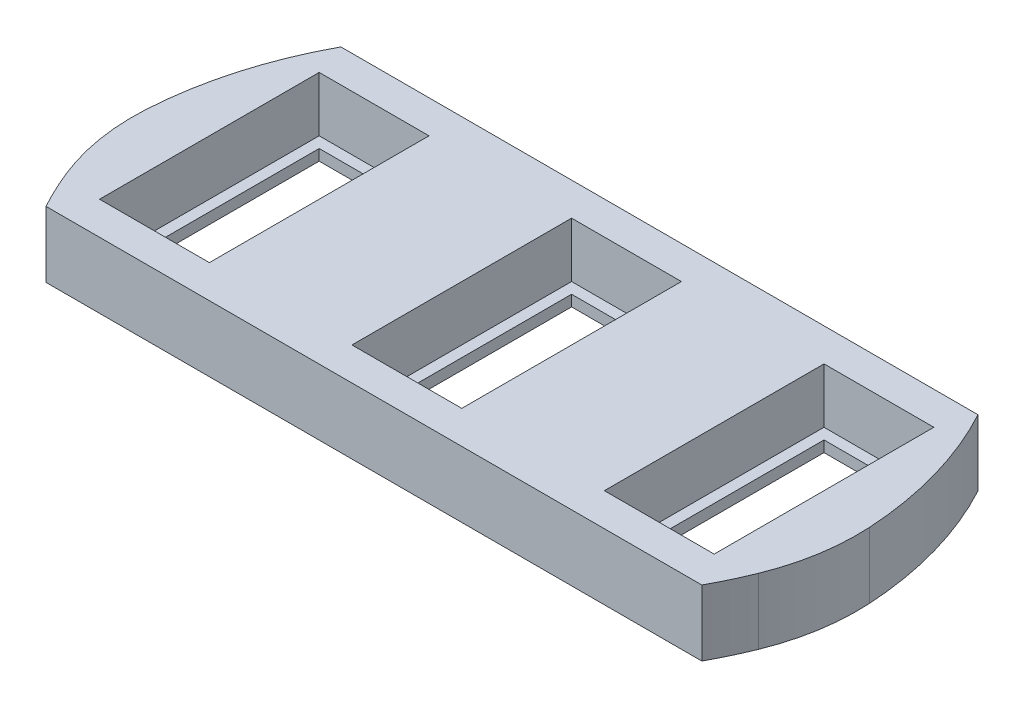
ISO-10303-21;
HEADER;
FILE_DESCRIPTION(('STEP AP214'),'2;1');
FILE_NAME('part.step','',(''),(''),'','','');
FILE_SCHEMA(('AUTOMOTIVE_DESIGN { 1 0 10303 214 1 1 1 1 }'));
ENDSEC;
DATA;
#1=APPLICATION_CONTEXT('core data for automotive mechanical design processes');
#2=APPLICATION_PROTOCOL_DEFINITION('international standard','automotive_design',2000,#1);
#3=PRODUCT_CONTEXT('',#1,'mechanical');
#4=PRODUCT('Part','Part','',(#3));
#5=PRODUCT_RELATED_PRODUCT_CATEGORY('part','',(#4));
#6=PRODUCT_DEFINITION_FORMATION('','',#4);
#7=PRODUCT_DEFINITION_CONTEXT('part definition',#1,'design');
#8=PRODUCT_DEFINITION('design','',#6,#7);
#9=PRODUCT_DEFINITION_SHAPE('','',#8);
#10=(LENGTH_UNIT() NAMED_UNIT(*) SI_UNIT(.MILLI.,.METRE.));
#11=(NAMED_UNIT(*) PLANE_ANGLE_UNIT() SI_UNIT($,.RADIAN.));
#12=(NAMED_UNIT(*) SI_UNIT($,.STERADIAN.) SOLID_ANGLE_UNIT());
#13=UNCERTAINTY_MEASURE_WITH_UNIT(LENGTH_MEASURE(1.E-05),#10,'distance_accuracy_value','');
#14=(GEOMETRIC_REPRESENTATION_CONTEXT(3) GLOBAL_UNCERTAINTY_ASSIGNED_CONTEXT((#13)) GLOBAL_UNIT_ASSIGNED_CONTEXT((#10,
#11,#12)) REPRESENTATION_CONTEXT('',''));
#15=CARTESIAN_POINT('',(0.,0.,0.));
#16=DIRECTION('',(0.,0.,1.));
#17=DIRECTION('',(1.,0.,0.));
#18=AXIS2_PLACEMENT_3D('',#15,#16,#17);
#19=CARTESIAN_POINT('',(0.,1.,3.));
#20=DIRECTION('',(0.,1.,0.));
#21=DIRECTION('',(0.,0.,1.));
#22=AXIS2_PLACEMENT_3D('',#19,#20,#21);
#23=PLANE('',#22);
#24=DIRECTION('',(0.,0.,1.));
#25=VECTOR('',#24,1.);
#26=CARTESIAN_POINT('',(-27.9834196579574,1.,-9.73882672379595));
#27=LINE('',#26,#25);
#28=CARTESIAN_POINT('',(-27.9834196579574,1.,-9.73882672379595));
#29=VERTEX_POINT('',#28);
#30=CARTESIAN_POINT('',(-27.9834196579574,1.,10.2611732762041));
#31=VERTEX_POINT('',#30);
#32=EDGE_CURVE('E48',#29,#31,#27,.T.);
#33=ORIENTED_EDGE('',*,*,#32,.T.);
#34=DIRECTION('',(1.,0.,0.));
#35=VECTOR('',#34,1.);
#36=CARTESIAN_POINT('',(-27.9834196579574,1.,10.2611732762041));
#37=LINE('',#36,#35);
#38=CARTESIAN_POINT('',(-17.9834196579574,1.,10.2611732762041));
#39=VERTEX_POINT('',#38);
#40=EDGE_CURVE('E52',#31,#39,#37,.T.);
#41=ORIENTED_EDGE('',*,*,#40,.T.);
#42=DIRECTION('',(0.,0.,-1.));
#43=VECTOR('',#42,1.);
#44=CARTESIAN_POINT('',(-17.9834196579574,1.,-9.73882672379595));
#45=LINE('',#44,#43);
#46=CARTESIAN_POINT('',(-17.9834196579574,1.,-9.73882672379595));
#47=VERTEX_POINT('',#46);
#48=EDGE_CURVE('E324',#39,#47,#45,.T.);
#49=ORIENTED_EDGE('',*,*,#48,.T.);
#50=DIRECTION('',(-1.,0.,0.));
#51=VECTOR('',#50,1.);
#52=CARTESIAN_POINT('',(-27.9834196579574,1.,-9.73882672379595));
#53=LINE('',#52,#51);
#54=EDGE_CURVE('E314',#47,#29,#53,.T.);
#55=ORIENTED_EDGE('',*,*,#54,.T.);
#56=EDGE_LOOP('',(#33,#41,#49,#55));
#57=FACE_BOUND('',#56,.T.);
#58=DIRECTION('',(1.,0.,0.));
#59=VECTOR('',#58,1.);
#60=CARTESIAN_POINT('',(-26.9834196579574,1.,9.26117327620406));
#61=LINE('',#60,#59);
#62=CARTESIAN_POINT('',(-26.9834196579574,1.,9.26117327620406));
#63=VERTEX_POINT('',#62);
#64=CARTESIAN_POINT('',(-18.9834196579574,1.,9.26117327620405));
#65=VERTEX_POINT('',#64);
#66=EDGE_CURVE('E426',#63,#65,#61,.T.);
#67=ORIENTED_EDGE('',*,*,#66,.F.);
#68=DIRECTION('',(0.,0.,1.));
#69=VECTOR('',#68,1.);
#70=CARTESIAN_POINT('',(-26.9834196579574,1.,-8.73882672379595));
#71=LINE('',#70,#69);
#72=CARTESIAN_POINT('',(-26.9834196579574,1.,-8.73882672379595));
#73=VERTEX_POINT('',#72);
#74=EDGE_CURVE('E424',#73,#63,#71,.T.);
#75=ORIENTED_EDGE('',*,*,#74,.F.);
#76=DIRECTION('',(-1.,0.,0.));
#77=VECTOR('',#76,1.);
#78=CARTESIAN_POINT('',(-26.9834196579574,1.,-8.73882672379595));
#79=LINE('',#78,#77);
#80=CARTESIAN_POINT('',(-18.9834196579574,1.,-8.73882672379595));
#81=VERTEX_POINT('',#80);
#82=EDGE_CURVE('E432',#81,#73,#79,.T.);
#83=ORIENTED_EDGE('',*,*,#82,.F.);
#84=DIRECTION('',(0.,0.,-1.));
#85=VECTOR('',#84,1.);
#86=CARTESIAN_POINT('',(-18.9834196579574,1.,-8.73882672379595));
#87=LINE('',#86,#85);
#88=EDGE_CURVE('E429',#65,#81,#87,.T.);
#89=ORIENTED_EDGE('',*,*,#88,.F.);
#90=EDGE_LOOP('',(#67,#75,#83,#89));
#91=FACE_BOUND('',#90,.T.);
#92=ADVANCED_FACE('F33',(#57,#91),#23,.T.);
#93=DIRECTION('',(0.,0.,1.));
#94=VECTOR('',#93,1.);
#95=CARTESIAN_POINT('',(-5.,1.,-9.73882672379595));
#96=LINE('',#95,#94);
#97=CARTESIAN_POINT('',(-5.,1.,-9.73882672379595));
#98=VERTEX_POINT('',#97);
#99=CARTESIAN_POINT('',(-5.,1.,10.2611732762041));
#100=VERTEX_POINT('',#99);
#101=EDGE_CURVE('E260',#98,#100,#96,.T.);
#102=ORIENTED_EDGE('',*,*,#101,.T.);
#103=DIRECTION('',(1.,0.,0.));
#104=VECTOR('',#103,1.);
#105=CARTESIAN_POINT('',(-5.,1.,10.2611732762041));
#106=LINE('',#105,#104);
#107=CARTESIAN_POINT('',(5.,1.,10.2611732762041));
#108=VERTEX_POINT('',#107);
#109=EDGE_CURVE('E295',#100,#108,#106,.T.);
#110=ORIENTED_EDGE('',*,*,#109,.T.);
#111=DIRECTION('',(0.,0.,-1.));
#112=VECTOR('',#111,1.);
#113=CARTESIAN_POINT('',(5.,1.,-9.73882672379595));
#114=LINE('',#113,#112);
#115=CARTESIAN_POINT('',(5.,1.,-9.73882672379595));
#116=VERTEX_POINT('',#115);
#117=EDGE_CURVE('E297',#108,#116,#114,.T.);
#118=ORIENTED_EDGE('',*,*,#117,.T.);
#119=DIRECTION('',(-1.,0.,0.));
#120=VECTOR('',#119,1.);
#121=CARTESIAN_POINT('',(-5.,1.,-9.73882672379595));
#122=LINE('',#121,#120);
#123=EDGE_CURVE('E286',#116,#98,#122,.T.);
#124=ORIENTED_EDGE('',*,*,#123,.T.);
#125=EDGE_LOOP('',(#102,#110,#118,#124));
#126=FACE_BOUND('',#125,.T.);
#127=DIRECTION('',(1.,0.,0.));
#128=VECTOR('',#127,1.);
#129=CARTESIAN_POINT('',(4.00000000000001,1.,9.26117327620405));
#130=LINE('',#129,#128);
#131=CARTESIAN_POINT('',(-4.,1.,9.26117327620405));
#132=VERTEX_POINT('',#131);
#133=CARTESIAN_POINT('',(4.00000000000001,1.,9.26117327620405));
#134=VERTEX_POINT('',#133);
#135=EDGE_CURVE('E395',#132,#134,#130,.T.);
#136=ORIENTED_EDGE('',*,*,#135,.F.);
#137=DIRECTION('',(0.,0.,1.));
#138=VECTOR('',#137,1.);
#139=CARTESIAN_POINT('',(-4.,1.,-8.73882672379594));
#140=LINE('',#139,#138);
#141=CARTESIAN_POINT('',(-4.,1.,-8.73882672379594));
#142=VERTEX_POINT('',#141);
#143=EDGE_CURVE('E393',#142,#132,#140,.T.);
#144=ORIENTED_EDGE('',*,*,#143,.F.);
#145=DIRECTION('',(-1.,0.,0.));
#146=VECTOR('',#145,1.);
#147=CARTESIAN_POINT('',(4.00000000000001,1.,-8.73882672379595));
#148=LINE('',#147,#146);
#149=CARTESIAN_POINT('',(4.00000000000001,1.,-8.73882672379595));
#150=VERTEX_POINT('',#149);
#151=EDGE_CURVE('E401',#150,#142,#148,.T.);
#152=ORIENTED_EDGE('',*,*,#151,.F.);
#153=DIRECTION('',(0.,0.,-1.));
#154=VECTOR('',#153,1.);
#155=CARTESIAN_POINT('',(4.00000000000001,1.,-8.73882672379595));
#156=LINE('',#155,#154);
#157=EDGE_CURVE('E398',#134,#150,#156,.T.);
#158=ORIENTED_EDGE('',*,*,#157,.F.);
#159=EDGE_LOOP('',(#136,#144,#152,#158));
#160=FACE_BOUND('',#159,.T.);
#161=ADVANCED_FACE('F531',(#126,#160),#23,.T.);
#162=DIRECTION('',(-1.,0.,0.));
#163=VECTOR('',#162,1.);
#164=CARTESIAN_POINT('',(27.9834196579574,1.,-9.73882672379595));
#165=LINE('',#164,#163);
#166=CARTESIAN_POINT('',(27.9834196579574,1.,-9.73882672379595));
#167=VERTEX_POINT('',#166);
#168=CARTESIAN_POINT('',(17.9834196579574,1.,-9.73882672379595));
#169=VERTEX_POINT('',#168);
#170=EDGE_CURVE('E272',#167,#169,#165,.T.);
#171=ORIENTED_EDGE('',*,*,#170,.T.);
#172=DIRECTION('',(0.,0.,1.));
#173=VECTOR('',#172,1.);
#174=CARTESIAN_POINT('',(17.9834196579574,1.,-9.73882672379595));
#175=LINE('',#174,#173);
#176=CARTESIAN_POINT('',(17.9834196579574,1.,10.2611732762041));
#177=VERTEX_POINT('',#176);
#178=EDGE_CURVE('E259',#169,#177,#175,.T.);
#179=ORIENTED_EDGE('',*,*,#178,.T.);
#180=DIRECTION('',(1.,0.,0.));
#181=VECTOR('',#180,1.);
#182=CARTESIAN_POINT('',(27.9834196579574,1.,10.2611732762041));
#183=LINE('',#182,#181);
#184=CARTESIAN_POINT('',(27.9834196579574,1.,10.2611732762041));
#185=VERTEX_POINT('',#184);
#186=EDGE_CURVE('E275',#177,#185,#183,.T.);
#187=ORIENTED_EDGE('',*,*,#186,.T.);
#188=DIRECTION('',(0.,0.,-1.));
#189=VECTOR('',#188,1.);
#190=CARTESIAN_POINT('',(27.9834196579574,1.,-9.73882672379595));
#191=LINE('',#190,#189);
#192=EDGE_CURVE('E252',#185,#167,#191,.T.);
#193=ORIENTED_EDGE('',*,*,#192,.T.);
#194=EDGE_LOOP('',(#171,#179,#187,#193));
#195=FACE_BOUND('',#194,.T.);
#196=DIRECTION('',(0.,0.,1.));
#197=VECTOR('',#196,1.);
#198=CARTESIAN_POINT('',(18.9834196579574,1.,-8.73882672379595));
#199=LINE('',#198,#197);
#200=CARTESIAN_POINT('',(18.9834196579574,1.,-8.73882672379595));
#201=VERTEX_POINT('',#200);
#202=CARTESIAN_POINT('',(18.9834196579574,1.,9.26117327620405));
#203=VERTEX_POINT('',#202);
#204=EDGE_CURVE('E364',#201,#203,#199,.T.);
#205=ORIENTED_EDGE('',*,*,#204,.F.);
#206=DIRECTION('',(-1.,0.,0.));
#207=VECTOR('',#206,1.);
#208=CARTESIAN_POINT('',(26.9834196579574,1.,-8.73882672379595));
#209=LINE('',#208,#207);
#210=CARTESIAN_POINT('',(26.9834196579574,1.,-8.73882672379595));
#211=VERTEX_POINT('',#210);
#212=EDGE_CURVE('E362',#211,#201,#209,.T.);
#213=ORIENTED_EDGE('',*,*,#212,.F.);
#214=DIRECTION('',(0.,0.,-1.));
#215=VECTOR('',#214,1.);
#216=CARTESIAN_POINT('',(26.9834196579574,1.,-8.73882672379595));
#217=LINE('',#216,#215);
#218=CARTESIAN_POINT('',(26.9834196579574,1.,9.26117327620405));
#219=VERTEX_POINT('',#218);
#220=EDGE_CURVE('E370',#219,#211,#217,.T.);
#221=ORIENTED_EDGE('',*,*,#220,.F.);
#222=DIRECTION('',(1.,0.,0.));
#223=VECTOR('',#222,1.);
#224=CARTESIAN_POINT('',(26.9834196579574,1.,9.26117327620405));
#225=LINE('',#224,#223);
#226=EDGE_CURVE('E367',#203,#219,#225,.T.);
#227=ORIENTED_EDGE('',*,*,#226,.F.);
#228=EDGE_LOOP('',(#205,#213,#221,#227));
#229=FACE_BOUND('',#228,.T.);
#230=ADVANCED_FACE('F533',(#195,#229),#23,.T.);
#231=CARTESIAN_POINT('',(0.,0.,3.));
#232=DIRECTION('',(0.,1.,0.));
#233=DIRECTION('',(0.,0.,1.));
#234=AXIS2_PLACEMENT_3D('',#231,#232,#233);
#235=PLANE('',#234);
#236=DIRECTION('',(0.,0.,1.));
#237=VECTOR('',#236,1.);
#238=CARTESIAN_POINT('',(-4.,0.,-8.73882672379594));
#239=LINE('',#238,#237);
#240=CARTESIAN_POINT('',(-4.,0.,-8.73882672379595));
#241=VERTEX_POINT('',#240);
#242=CARTESIAN_POINT('',(-4.,0.,9.26117327620405));
#243=VERTEX_POINT('',#242);
#244=EDGE_CURVE('E392',#241,#243,#239,.T.);
#245=ORIENTED_EDGE('',*,*,#244,.T.);
#246=DIRECTION('',(1.,0.,0.));
#247=VECTOR('',#246,1.);
#248=CARTESIAN_POINT('',(4.00000000000001,0.,9.26117327620405));
#249=LINE('',#248,#247);
#250=CARTESIAN_POINT('',(4.00000000000001,0.,9.26117327620405));
#251=VERTEX_POINT('',#250);
#252=EDGE_CURVE('E406',#243,#251,#249,.T.);
#253=ORIENTED_EDGE('',*,*,#252,.T.);
#254=DIRECTION('',(0.,0.,-1.));
#255=VECTOR('',#254,1.);
#256=CARTESIAN_POINT('',(4.00000000000001,0.,-8.73882672379595));
#257=LINE('',#256,#255);
#258=CARTESIAN_POINT('',(4.00000000000001,0.,-8.73882672379595));
#259=VERTEX_POINT('',#258);
#260=EDGE_CURVE('E409',#251,#259,#257,.T.);
#261=ORIENTED_EDGE('',*,*,#260,.T.);
#262=DIRECTION('',(-1.,0.,0.));
#263=VECTOR('',#262,1.);
#264=CARTESIAN_POINT('',(4.00000000000001,0.,-8.73882672379595));
#265=LINE('',#264,#263);
#266=EDGE_CURVE('E396',#259,#241,#265,.T.);
#267=ORIENTED_EDGE('',*,*,#266,.T.);
#268=EDGE_LOOP('',(#245,#253,#261,#267));
#269=FACE_BOUND('',#268,.T.);
#270=CARTESIAN_POINT('',(0.,0.,3.));
#271=DIRECTION('',(0.,1.,0.));
#272=DIRECTION('',(0.,0.,1.));
#273=AXIS2_PLACEMENT_3D('',#270,#271,#272);
#274=CIRCLE('',#273,33.);
#275=CARTESIAN_POINT('',(-29.0049880771968,0.,-12.7388267237959));
#276=VERTEX_POINT('',#275);
#277=CARTESIAN_POINT('',(-32.9450355869057,0.,1.09615384615388));
#278=VERTEX_POINT('',#277);
#279=EDGE_CURVE('E454',#276,#278,#274,.T.);
#280=ORIENTED_EDGE('',*,*,#279,.F.);
#281=DIRECTION('',(-1.,0.,0.));
#282=VECTOR('',#281,1.);
#283=CARTESIAN_POINT('',(29.0049880771968,0.,-12.7388267237959));
#284=LINE('',#283,#282);
#285=CARTESIAN_POINT('',(29.0049880771968,0.,-12.7388267237959));
#286=VERTEX_POINT('',#285);
#287=EDGE_CURVE('E469',#286,#276,#284,.T.);
#288=ORIENTED_EDGE('',*,*,#287,.F.);
#289=CARTESIAN_POINT('',(0.,0.,3.));
#290=DIRECTION('',(0.,1.,0.));
#291=DIRECTION('',(0.,0.,-1.));
#292=AXIS2_PLACEMENT_3D('',#289,#290,#291);
#293=CIRCLE('',#292,33.);
#294=CARTESIAN_POINT('',(32.9450355869058,0.,1.09615384615386));
#295=VERTEX_POINT('',#294);
#296=EDGE_CURVE('E467',#295,#286,#293,.T.);
#297=ORIENTED_EDGE('',*,*,#296,.F.);
#298=CARTESIAN_POINT('',(12.9783473524174,0.,2.25000000000001));
#299=DIRECTION('',(0.,1.,0.));
#300=DIRECTION('',(0.,0.,-1.));
#301=AXIS2_PLACEMENT_3D('',#298,#299,#300);
#302=CIRCLE('',#301,20.);
#303=CARTESIAN_POINT('',(31.5188435701566,0.,9.75000000000001));
#304=VERTEX_POINT('',#303);
#305=EDGE_CURVE('E465',#304,#295,#302,.T.);
#306=ORIENTED_EDGE('',*,*,#305,.F.);
#307=CARTESIAN_POINT('',(0.,0.,-3.));
#308=DIRECTION('',(0.,1.,0.));
#309=DIRECTION('',(0.,0.,-1.));
#310=AXIS2_PLACEMENT_3D('',#307,#308,#309);
#311=CIRCLE('',#310,34.);
#312=CARTESIAN_POINT('',(29.859240507442,0.,13.261173276204));
#313=VERTEX_POINT('',#312);
#314=EDGE_CURVE('E463',#313,#304,#311,.T.);
#315=ORIENTED_EDGE('',*,*,#314,.F.);
#316=DIRECTION('',(1.,0.,0.));
#317=VECTOR('',#316,1.);
#318=CARTESIAN_POINT('',(-29.859240507442,0.,13.2611732762041));
#319=LINE('',#318,#317);
#320=CARTESIAN_POINT('',(-29.859240507442,0.,13.261173276204));
#321=VERTEX_POINT('',#320);
#322=EDGE_CURVE('E461',#321,#313,#319,.T.);
#323=ORIENTED_EDGE('',*,*,#322,.F.);
#324=CARTESIAN_POINT('',(0.,0.,-3.));
#325=DIRECTION('',(0.,1.,0.));
#326=DIRECTION('',(0.,0.,1.));
#327=AXIS2_PLACEMENT_3D('',#324,#325,#326);
#328=CIRCLE('',#327,34.);
#329=CARTESIAN_POINT('',(-31.5188435701566,0.,9.75000000000002));
#330=VERTEX_POINT('',#329);
#331=EDGE_CURVE('E459',#330,#321,#328,.T.);
#332=ORIENTED_EDGE('',*,*,#331,.F.);
#333=CARTESIAN_POINT('',(-12.9783473524174,0.,2.25000000000001));
#334=DIRECTION('',(0.,1.,0.));
#335=DIRECTION('',(0.,0.,1.));
#336=AXIS2_PLACEMENT_3D('',#333,#334,#335);
#337=CIRCLE('',#336,20.);
#338=EDGE_CURVE('E457',#278,#330,#337,.T.);
#339=ORIENTED_EDGE('',*,*,#338,.F.);
#340=EDGE_LOOP('',(#280,#288,#297,#306,#315,#323,#332,#339));
#341=FACE_BOUND('',#340,.T.);
#342=DIRECTION('',(0.,0.,1.));
#343=VECTOR('',#342,1.);
#344=CARTESIAN_POINT('',(-26.9834196579574,0.,-8.73882672379595));
#345=LINE('',#344,#343);
#346=CARTESIAN_POINT('',(-26.9834196579574,0.,-8.73882672379594));
#347=VERTEX_POINT('',#346);
#348=CARTESIAN_POINT('',(-26.9834196579574,0.,9.26117327620406));
#349=VERTEX_POINT('',#348);
#350=EDGE_CURVE('E423',#347,#349,#345,.T.);
#351=ORIENTED_EDGE('',*,*,#350,.T.);
#352=DIRECTION('',(1.,0.,0.));
#353=VECTOR('',#352,1.);
#354=CARTESIAN_POINT('',(-26.9834196579574,0.,9.26117327620406));
#355=LINE('',#354,#353);
#356=CARTESIAN_POINT('',(-18.9834196579574,0.,9.26117327620405));
#357=VERTEX_POINT('',#356);
#358=EDGE_CURVE('E437',#349,#357,#355,.T.);
#359=ORIENTED_EDGE('',*,*,#358,.T.);
#360=DIRECTION('',(0.,0.,-1.));
#361=VECTOR('',#360,1.);
#362=CARTESIAN_POINT('',(-18.9834196579574,0.,-8.73882672379595));
#363=LINE('',#362,#361);
#364=CARTESIAN_POINT('',(-18.9834196579574,0.,-8.73882672379595));
#365=VERTEX_POINT('',#364);
#366=EDGE_CURVE('E440',#357,#365,#363,.T.);
#367=ORIENTED_EDGE('',*,*,#366,.T.);
#368=DIRECTION('',(-1.,0.,0.));
#369=VECTOR('',#368,1.);
#370=CARTESIAN_POINT('',(-26.9834196579574,0.,-8.73882672379595));
#371=LINE('',#370,#369);
#372=EDGE_CURVE('E427',#365,#347,#371,.T.);
#373=ORIENTED_EDGE('',*,*,#372,.T.);
#374=EDGE_LOOP('',(#351,#359,#367,#373));
#375=FACE_BOUND('',#374,.T.);
#376=DIRECTION('',(-1.,0.,0.));
#377=VECTOR('',#376,1.);
#378=CARTESIAN_POINT('',(26.9834196579574,0.,-8.73882672379595));
#379=LINE('',#378,#377);
#380=CARTESIAN_POINT('',(26.9834196579574,0.,-8.73882672379595));
#381=VERTEX_POINT('',#380);
#382=CARTESIAN_POINT('',(18.9834196579574,0.,-8.73882672379595));
#383=VERTEX_POINT('',#382);
#384=EDGE_CURVE('E361',#381,#383,#379,.T.);
#385=ORIENTED_EDGE('',*,*,#384,.T.);
#386=DIRECTION('',(0.,0.,1.));
#387=VECTOR('',#386,1.);
#388=CARTESIAN_POINT('',(18.9834196579574,0.,-8.73882672379595));
#389=LINE('',#388,#387);
#390=CARTESIAN_POINT('',(18.9834196579574,0.,9.26117327620405));
#391=VERTEX_POINT('',#390);
#392=EDGE_CURVE('E375',#383,#391,#389,.T.);
#393=ORIENTED_EDGE('',*,*,#392,.T.);
#394=DIRECTION('',(1.,0.,0.));
#395=VECTOR('',#394,1.);
#396=CARTESIAN_POINT('',(26.9834196579574,0.,9.26117327620405));
#397=LINE('',#396,#395);
#398=CARTESIAN_POINT('',(26.9834196579574,0.,9.26117327620405));
#399=VERTEX_POINT('',#398);
#400=EDGE_CURVE('E378',#391,#399,#397,.T.);
#401=ORIENTED_EDGE('',*,*,#400,.T.);
#402=DIRECTION('',(0.,0.,-1.));
#403=VECTOR('',#402,1.);
#404=CARTESIAN_POINT('',(26.9834196579574,0.,-8.73882672379595));
#405=LINE('',#404,#403);
#406=EDGE_CURVE('E365',#399,#381,#405,.T.);
#407=ORIENTED_EDGE('',*,*,#406,.T.);
#408=EDGE_LOOP('',(#385,#393,#401,#407));
#409=FACE_BOUND('',#408,.T.);
#410=ADVANCED_FACE('F498',(#269,#341,#375,#409),#235,.F.);
#411=CARTESIAN_POINT('',(0.,1.,3.));
#412=DIRECTION('',(0.,-1.,0.));
#413=DIRECTION('',(0.,0.,-1.));
#414=AXIS2_PLACEMENT_3D('',#411,#412,#413);
#415=CYLINDRICAL_SURFACE('',#414,33.);
#416=ORIENTED_EDGE('',*,*,#279,.T.);
#417=DIRECTION('',(0.,-1.,0.));
#418=VECTOR('',#417,1.);
#419=CARTESIAN_POINT('',(-32.9450355869057,1.,1.09615384615388));
#420=LINE('',#419,#418);
#421=CARTESIAN_POINT('',(-32.9450355869057,6.,1.09615384615388));
#422=VERTEX_POINT('',#421);
#423=EDGE_CURVE('E11',#422,#278,#420,.T.);
#424=ORIENTED_EDGE('',*,*,#423,.F.);
#425=CARTESIAN_POINT('',(0.,6.,3.));
#426=DIRECTION('',(0.,1.,0.));
#427=DIRECTION('',(0.,0.,1.));
#428=AXIS2_PLACEMENT_3D('',#425,#426,#427);
#429=CIRCLE('',#428,33.);
#430=CARTESIAN_POINT('',(-29.0049880771968,6.,-12.7388267237959));
#431=VERTEX_POINT('',#430);
#432=EDGE_CURVE('E337',#431,#422,#429,.T.);
#433=ORIENTED_EDGE('',*,*,#432,.F.);
#434=DIRECTION('',(0.,-1.,0.));
#435=VECTOR('',#434,1.);
#436=CARTESIAN_POINT('',(-29.0049880771968,1.,-12.7388267237959));
#437=LINE('',#436,#435);
#438=EDGE_CURVE('E471',#431,#276,#437,.T.);
#439=ORIENTED_EDGE('',*,*,#438,.T.);
#440=EDGE_LOOP('',(#416,#424,#433,#439));
#441=FACE_BOUND('',#440,.T.);
#442=ADVANCED_FACE('F35',(#441),#415,.T.);
#443=CARTESIAN_POINT('',(-12.9783473524174,1.,2.25000000000001));
#444=DIRECTION('',(0.,-1.,0.));
#445=DIRECTION('',(0.,0.,-1.));
#446=AXIS2_PLACEMENT_3D('',#443,#444,#445);
#447=CYLINDRICAL_SURFACE('',#446,20.);
#448=ORIENTED_EDGE('',*,*,#338,.T.);
#449=DIRECTION('',(0.,-1.,0.));
#450=VECTOR('',#449,1.);
#451=CARTESIAN_POINT('',(-31.5188435701566,1.,9.75000000000002));
#452=LINE('',#451,#450);
#453=CARTESIAN_POINT('',(-31.5188435701566,6.,9.75000000000002));
#454=VERTEX_POINT('',#453);
#455=EDGE_CURVE('E41',#454,#330,#452,.T.);
#456=ORIENTED_EDGE('',*,*,#455,.F.);
#457=CARTESIAN_POINT('',(-12.9783473524174,6.,2.25000000000001));
#458=DIRECTION('',(0.,1.,0.));
#459=DIRECTION('',(0.,0.,1.));
#460=AXIS2_PLACEMENT_3D('',#457,#458,#459);
#461=CIRCLE('',#460,20.);
#462=EDGE_CURVE('E340',#422,#454,#461,.T.);
#463=ORIENTED_EDGE('',*,*,#462,.F.);
#464=ORIENTED_EDGE('',*,*,#423,.T.);
#465=EDGE_LOOP('',(#448,#456,#463,#464));
#466=FACE_BOUND('',#465,.T.);
#467=ADVANCED_FACE('F523',(#466),#447,.T.);
#468=CARTESIAN_POINT('',(0.,1.,-3.));
#469=DIRECTION('',(0.,-1.,0.));
#470=DIRECTION('',(0.,0.,-1.));
#471=AXIS2_PLACEMENT_3D('',#468,#469,#470);
#472=CYLINDRICAL_SURFACE('',#471,34.);
#473=ORIENTED_EDGE('',*,*,#331,.T.);
#474=DIRECTION('',(0.,-1.,0.));
#475=VECTOR('',#474,1.);
#476=CARTESIAN_POINT('',(-29.859240507442,1.,13.261173276204));
#477=LINE('',#476,#475);
#478=CARTESIAN_POINT('',(-29.859240507442,6.,13.261173276204));
#479=VERTEX_POINT('',#478);
#480=EDGE_CURVE('E486',#479,#321,#477,.T.);
#481=ORIENTED_EDGE('',*,*,#480,.F.);
#482=CARTESIAN_POINT('',(0.,6.,-3.));
#483=DIRECTION('',(0.,1.,0.));
#484=DIRECTION('',(0.,0.,1.));
#485=AXIS2_PLACEMENT_3D('',#482,#483,#484);
#486=CIRCLE('',#485,34.);
#487=EDGE_CURVE('E343',#454,#479,#486,.T.);
#488=ORIENTED_EDGE('',*,*,#487,.F.);
#489=ORIENTED_EDGE('',*,*,#455,.T.);
#490=EDGE_LOOP('',(#473,#481,#488,#489));
#491=FACE_BOUND('',#490,.T.);
#492=ADVANCED_FACE('F492',(#491),#472,.T.);
#493=CARTESIAN_POINT('',(-29.859240507442,1.,13.2611732762041));
#494=DIRECTION('',(0.,0.,-1.));
#495=DIRECTION('',(-1.,0.,0.));
#496=AXIS2_PLACEMENT_3D('',#493,#494,#495);
#497=PLANE('',#496);
#498=ORIENTED_EDGE('',*,*,#322,.T.);
#499=DIRECTION('',(0.,-1.,0.));
#500=VECTOR('',#499,1.);
#501=CARTESIAN_POINT('',(29.859240507442,1.,13.261173276204));
#502=LINE('',#501,#500);
#503=CARTESIAN_POINT('',(29.859240507442,6.,13.261173276204));
#504=VERTEX_POINT('',#503);
#505=EDGE_CURVE('E483',#504,#313,#502,.T.);
#506=ORIENTED_EDGE('',*,*,#505,.F.);
#507=DIRECTION('',(1.,0.,0.));
#508=VECTOR('',#507,1.);
#509=CARTESIAN_POINT('',(0.,6.,13.261173276204));
#510=LINE('',#509,#508);
#511=EDGE_CURVE('E346',#479,#504,#510,.T.);
#512=ORIENTED_EDGE('',*,*,#511,.F.);
#513=ORIENTED_EDGE('',*,*,#480,.T.);
#514=EDGE_LOOP('',(#498,#506,#512,#513));
#515=FACE_BOUND('',#514,.T.);
#516=ADVANCED_FACE('F503',(#515),#497,.F.);
#517=CARTESIAN_POINT('',(0.,1.,-3.));
#518=DIRECTION('',(0.,-1.,0.));
#519=DIRECTION('',(0.,0.,-1.));
#520=AXIS2_PLACEMENT_3D('',#517,#518,#519);
#521=CYLINDRICAL_SURFACE('',#520,34.);
#522=ORIENTED_EDGE('',*,*,#314,.T.);
#523=DIRECTION('',(0.,-1.,0.));
#524=VECTOR('',#523,1.);
#525=CARTESIAN_POINT('',(31.5188435701566,1.,9.75000000000001));
#526=LINE('',#525,#524);
#527=CARTESIAN_POINT('',(31.5188435701566,6.,9.75000000000002));
#528=VERTEX_POINT('',#527);
#529=EDGE_CURVE('E480',#528,#304,#526,.T.);
#530=ORIENTED_EDGE('',*,*,#529,.F.);
#531=CARTESIAN_POINT('',(0.,6.,-3.));
#532=DIRECTION('',(0.,1.,0.));
#533=DIRECTION('',(0.,0.,1.));
#534=AXIS2_PLACEMENT_3D('',#531,#532,#533);
#535=CIRCLE('',#534,34.);
#536=EDGE_CURVE('E349',#504,#528,#535,.T.);
#537=ORIENTED_EDGE('',*,*,#536,.F.);
#538=ORIENTED_EDGE('',*,*,#505,.T.);
#539=EDGE_LOOP('',(#522,#530,#537,#538));
#540=FACE_BOUND('',#539,.T.);
#541=ADVANCED_FACE('F507',(#540),#521,.T.);
#542=CARTESIAN_POINT('',(12.9783473524174,1.,2.25000000000001));
#543=DIRECTION('',(0.,-1.,0.));
#544=DIRECTION('',(0.,0.,-1.));
#545=AXIS2_PLACEMENT_3D('',#542,#543,#544);
#546=CYLINDRICAL_SURFACE('',#545,20.);
#547=ORIENTED_EDGE('',*,*,#305,.T.);
#548=DIRECTION('',(0.,-1.,0.));
#549=VECTOR('',#548,1.);
#550=CARTESIAN_POINT('',(32.9450355869058,1.,1.09615384615386));
#551=LINE('',#550,#549);
#552=CARTESIAN_POINT('',(32.9450355869057,6.,1.09615384615388));
#553=VERTEX_POINT('',#552);
#554=EDGE_CURVE('E477',#553,#295,#551,.T.);
#555=ORIENTED_EDGE('',*,*,#554,.F.);
#556=CARTESIAN_POINT('',(12.9783473524174,6.,2.25000000000001));
#557=DIRECTION('',(0.,1.,0.));
#558=DIRECTION('',(0.,0.,1.));
#559=AXIS2_PLACEMENT_3D('',#556,#557,#558);
#560=CIRCLE('',#559,20.);
#561=EDGE_CURVE('E352',#528,#553,#560,.T.);
#562=ORIENTED_EDGE('',*,*,#561,.F.);
#563=ORIENTED_EDGE('',*,*,#529,.T.);
#564=EDGE_LOOP('',(#547,#555,#562,#563));
#565=FACE_BOUND('',#564,.T.);
#566=ADVANCED_FACE('F513',(#565),#546,.T.);
#567=CARTESIAN_POINT('',(0.,1.,3.));
#568=DIRECTION('',(0.,-1.,0.));
#569=DIRECTION('',(0.,0.,-1.));
#570=AXIS2_PLACEMENT_3D('',#567,#568,#569);
#571=CYLINDRICAL_SURFACE('',#570,33.);
#572=ORIENTED_EDGE('',*,*,#296,.T.);
#573=DIRECTION('',(0.,-1.,0.));
#574=VECTOR('',#573,1.);
#575=CARTESIAN_POINT('',(29.0049880771968,1.,-12.7388267237959));
#576=LINE('',#575,#574);
#577=CARTESIAN_POINT('',(29.0049880771968,6.,-12.7388267237959));
#578=VERTEX_POINT('',#577);
#579=EDGE_CURVE('E474',#578,#286,#576,.T.);
#580=ORIENTED_EDGE('',*,*,#579,.F.);
#581=CARTESIAN_POINT('',(0.,6.,3.));
#582=DIRECTION('',(0.,1.,0.));
#583=DIRECTION('',(0.,0.,1.));
#584=AXIS2_PLACEMENT_3D('',#581,#582,#583);
#585=CIRCLE('',#584,33.);
#586=EDGE_CURVE('E355',#553,#578,#585,.T.);
#587=ORIENTED_EDGE('',*,*,#586,.F.);
#588=ORIENTED_EDGE('',*,*,#554,.T.);
#589=EDGE_LOOP('',(#572,#580,#587,#588));
#590=FACE_BOUND('',#589,.T.);
#591=ADVANCED_FACE('F516',(#590),#571,.T.);
#592=CARTESIAN_POINT('',(29.0049880771968,1.,-12.7388267237959));
#593=DIRECTION('',(0.,0.,1.));
#594=DIRECTION('',(1.,0.,0.));
#595=AXIS2_PLACEMENT_3D('',#592,#593,#594);
#596=PLANE('',#595);
#597=ORIENTED_EDGE('',*,*,#287,.T.);
#598=ORIENTED_EDGE('',*,*,#438,.F.);
#599=DIRECTION('',(-1.,0.,0.));
#600=VECTOR('',#599,1.);
#601=CARTESIAN_POINT('',(-29.0049880771968,6.,-12.7388267237959));
#602=LINE('',#601,#600);
#603=EDGE_CURVE('E358',#578,#431,#602,.T.);
#604=ORIENTED_EDGE('',*,*,#603,.F.);
#605=ORIENTED_EDGE('',*,*,#579,.T.);
#606=EDGE_LOOP('',(#597,#598,#604,#605));
#607=FACE_BOUND('',#606,.T.);
#608=ADVANCED_FACE('F519',(#607),#596,.F.);
#609=CARTESIAN_POINT('',(-26.9834196579574,1.,-8.73882672379595));
#610=DIRECTION('',(1.,0.,0.));
#611=DIRECTION('',(0.,0.,-1.));
#612=AXIS2_PLACEMENT_3D('',#609,#610,#611);
#613=PLANE('',#612);
#614=ORIENTED_EDGE('',*,*,#350,.F.);
#615=DIRECTION('',(0.,-1.,0.));
#616=VECTOR('',#615,1.);
#617=CARTESIAN_POINT('',(-26.9834196579574,1.,-8.73882672379595));
#618=LINE('',#617,#616);
#619=EDGE_CURVE('E434',#73,#347,#618,.T.);
#620=ORIENTED_EDGE('',*,*,#619,.F.);
#621=ORIENTED_EDGE('',*,*,#74,.T.);
#622=DIRECTION('',(0.,-1.,0.));
#623=VECTOR('',#622,1.);
#624=CARTESIAN_POINT('',(-26.9834196579574,1.,9.26117327620406));
#625=LINE('',#624,#623);
#626=EDGE_CURVE('E451',#63,#349,#625,.T.);
#627=ORIENTED_EDGE('',*,*,#626,.T.);
#628=EDGE_LOOP('',(#614,#620,#621,#627));
#629=FACE_BOUND('',#628,.T.);
#630=ADVANCED_FACE('F607',(#629),#613,.T.);
#631=CARTESIAN_POINT('',(-26.9834196579574,1.,9.26117327620406));
#632=DIRECTION('',(0.,0.,-1.));
#633=DIRECTION('',(-1.,0.,0.));
#634=AXIS2_PLACEMENT_3D('',#631,#632,#633);
#635=PLANE('',#634);
#636=ORIENTED_EDGE('',*,*,#358,.F.);
#637=ORIENTED_EDGE('',*,*,#626,.F.);
#638=ORIENTED_EDGE('',*,*,#66,.T.);
#639=DIRECTION('',(0.,-1.,0.));
#640=VECTOR('',#639,1.);
#641=CARTESIAN_POINT('',(-18.9834196579574,1.,9.26117327620405));
#642=LINE('',#641,#640);
#643=EDGE_CURVE('E449',#65,#357,#642,.T.);
#644=ORIENTED_EDGE('',*,*,#643,.T.);
#645=EDGE_LOOP('',(#636,#637,#638,#644));
#646=FACE_BOUND('',#645,.T.);
#647=ADVANCED_FACE('F604',(#646),#635,.T.);
#648=CARTESIAN_POINT('',(-18.9834196579574,1.,-8.73882672379595));
#649=DIRECTION('',(-1.,0.,0.));
#650=DIRECTION('',(0.,0.,1.));
#651=AXIS2_PLACEMENT_3D('',#648,#649,#650);
#652=PLANE('',#651);
#653=ORIENTED_EDGE('',*,*,#366,.F.);
#654=ORIENTED_EDGE('',*,*,#643,.F.);
#655=ORIENTED_EDGE('',*,*,#88,.T.);
#656=DIRECTION('',(0.,-1.,0.));
#657=VECTOR('',#656,1.);
#658=CARTESIAN_POINT('',(-18.9834196579574,1.,-8.73882672379595));
#659=LINE('',#658,#657);
#660=EDGE_CURVE('E447',#81,#365,#659,.T.);
#661=ORIENTED_EDGE('',*,*,#660,.T.);
#662=EDGE_LOOP('',(#653,#654,#655,#661));
#663=FACE_BOUND('',#662,.T.);
#664=ADVANCED_FACE('F600',(#663),#652,.T.);
#665=CARTESIAN_POINT('',(-26.9834196579574,1.,-8.73882672379595));
#666=DIRECTION('',(0.,0.,1.));
#667=DIRECTION('',(1.,0.,0.));
#668=AXIS2_PLACEMENT_3D('',#665,#666,#667);
#669=PLANE('',#668);
#670=ORIENTED_EDGE('',*,*,#372,.F.);
#671=ORIENTED_EDGE('',*,*,#660,.F.);
#672=ORIENTED_EDGE('',*,*,#82,.T.);
#673=ORIENTED_EDGE('',*,*,#619,.T.);
#674=EDGE_LOOP('',(#670,#671,#672,#673));
#675=FACE_BOUND('',#674,.T.);
#676=ADVANCED_FACE('F596',(#675),#669,.T.);
#677=CARTESIAN_POINT('',(-4.,1.,-8.73882672379594));
#678=DIRECTION('',(1.,0.,0.));
#679=DIRECTION('',(0.,0.,-1.));
#680=AXIS2_PLACEMENT_3D('',#677,#678,#679);
#681=PLANE('',#680);
#682=ORIENTED_EDGE('',*,*,#244,.F.);
#683=DIRECTION('',(0.,-1.,0.));
#684=VECTOR('',#683,1.);
#685=CARTESIAN_POINT('',(-4.,1.,-8.73882672379594));
#686=LINE('',#685,#684);
#687=EDGE_CURVE('E403',#142,#241,#686,.T.);
#688=ORIENTED_EDGE('',*,*,#687,.F.);
#689=ORIENTED_EDGE('',*,*,#143,.T.);
#690=DIRECTION('',(0.,-1.,0.));
#691=VECTOR('',#690,1.);
#692=CARTESIAN_POINT('',(-4.,1.,9.26117327620405));
#693=LINE('',#692,#691);
#694=EDGE_CURVE('E420',#132,#243,#693,.T.);
#695=ORIENTED_EDGE('',*,*,#694,.T.);
#696=EDGE_LOOP('',(#682,#688,#689,#695));
#697=FACE_BOUND('',#696,.T.);
#698=ADVANCED_FACE('F592',(#697),#681,.T.);
#699=CARTESIAN_POINT('',(4.00000000000001,1.,9.26117327620405));
#700=DIRECTION('',(0.,0.,-1.));
#701=DIRECTION('',(-1.,0.,0.));
#702=AXIS2_PLACEMENT_3D('',#699,#700,#701);
#703=PLANE('',#702);
#704=ORIENTED_EDGE('',*,*,#252,.F.);
#705=ORIENTED_EDGE('',*,*,#694,.F.);
#706=ORIENTED_EDGE('',*,*,#135,.T.);
#707=DIRECTION('',(0.,-1.,0.));
#708=VECTOR('',#707,1.);
#709=CARTESIAN_POINT('',(4.00000000000001,1.,9.26117327620405));
#710=LINE('',#709,#708);
#711=EDGE_CURVE('E418',#134,#251,#710,.T.);
#712=ORIENTED_EDGE('',*,*,#711,.T.);
#713=EDGE_LOOP('',(#704,#705,#706,#712));
#714=FACE_BOUND('',#713,.T.);
#715=ADVANCED_FACE('F588',(#714),#703,.T.);
#716=CARTESIAN_POINT('',(4.00000000000001,1.,-8.73882672379595));
#717=DIRECTION('',(-1.,0.,0.));
#718=DIRECTION('',(0.,0.,1.));
#719=AXIS2_PLACEMENT_3D('',#716,#717,#718);
#720=PLANE('',#719);
#721=ORIENTED_EDGE('',*,*,#260,.F.);
#722=ORIENTED_EDGE('',*,*,#711,.F.);
#723=ORIENTED_EDGE('',*,*,#157,.T.);
#724=DIRECTION('',(0.,-1.,0.));
#725=VECTOR('',#724,1.);
#726=CARTESIAN_POINT('',(4.00000000000001,1.,-8.73882672379595));
#727=LINE('',#726,#725);
#728=EDGE_CURVE('E416',#150,#259,#727,.T.);
#729=ORIENTED_EDGE('',*,*,#728,.T.);
#730=EDGE_LOOP('',(#721,#722,#723,#729));
#731=FACE_BOUND('',#730,.T.);
#732=ADVANCED_FACE('F584',(#731),#720,.T.);
#733=CARTESIAN_POINT('',(4.00000000000001,1.,-8.73882672379595));
#734=DIRECTION('',(0.,0.,1.));
#735=DIRECTION('',(1.,0.,0.));
#736=AXIS2_PLACEMENT_3D('',#733,#734,#735);
#737=PLANE('',#736);
#738=ORIENTED_EDGE('',*,*,#266,.F.);
#739=ORIENTED_EDGE('',*,*,#728,.F.);
#740=ORIENTED_EDGE('',*,*,#151,.T.);
#741=ORIENTED_EDGE('',*,*,#687,.T.);
#742=EDGE_LOOP('',(#738,#739,#740,#741));
#743=FACE_BOUND('',#742,.T.);
#744=ADVANCED_FACE('F581',(#743),#737,.T.);
#745=CARTESIAN_POINT('',(26.9834196579574,1.,-8.73882672379595));
#746=DIRECTION('',(0.,0.,1.));
#747=DIRECTION('',(1.,0.,0.));
#748=AXIS2_PLACEMENT_3D('',#745,#746,#747);
#749=PLANE('',#748);
#750=ORIENTED_EDGE('',*,*,#384,.F.);
#751=DIRECTION('',(0.,-1.,0.));
#752=VECTOR('',#751,1.);
#753=CARTESIAN_POINT('',(26.9834196579574,1.,-8.73882672379595));
#754=LINE('',#753,#752);
#755=EDGE_CURVE('E372',#211,#381,#754,.T.);
#756=ORIENTED_EDGE('',*,*,#755,.F.);
#757=ORIENTED_EDGE('',*,*,#212,.T.);
#758=DIRECTION('',(0.,-1.,0.));
#759=VECTOR('',#758,1.);
#760=CARTESIAN_POINT('',(18.9834196579574,1.,-8.73882672379595));
#761=LINE('',#760,#759);
#762=EDGE_CURVE('E389',#201,#383,#761,.T.);
#763=ORIENTED_EDGE('',*,*,#762,.T.);
#764=EDGE_LOOP('',(#750,#756,#757,#763));
#765=FACE_BOUND('',#764,.T.);
#766=ADVANCED_FACE('F562',(#765),#749,.T.);
#767=CARTESIAN_POINT('',(18.9834196579574,1.,-8.73882672379595));
#768=DIRECTION('',(1.,0.,0.));
#769=DIRECTION('',(0.,0.,-1.));
#770=AXIS2_PLACEMENT_3D('',#767,#768,#769);
#771=PLANE('',#770);
#772=ORIENTED_EDGE('',*,*,#392,.F.);
#773=ORIENTED_EDGE('',*,*,#762,.F.);
#774=ORIENTED_EDGE('',*,*,#204,.T.);
#775=DIRECTION('',(0.,-1.,0.));
#776=VECTOR('',#775,1.);
#777=CARTESIAN_POINT('',(18.9834196579574,1.,9.26117327620405));
#778=LINE('',#777,#776);
#779=EDGE_CURVE('E387',#203,#391,#778,.T.);
#780=ORIENTED_EDGE('',*,*,#779,.T.);
#781=EDGE_LOOP('',(#772,#773,#774,#780));
#782=FACE_BOUND('',#781,.T.);
#783=ADVANCED_FACE('F555',(#782),#771,.T.);
#784=CARTESIAN_POINT('',(26.9834196579574,1.,9.26117327620405));
#785=DIRECTION('',(0.,0.,-1.));
#786=DIRECTION('',(-1.,0.,0.));
#787=AXIS2_PLACEMENT_3D('',#784,#785,#786);
#788=PLANE('',#787);
#789=ORIENTED_EDGE('',*,*,#400,.F.);
#790=ORIENTED_EDGE('',*,*,#779,.F.);
#791=ORIENTED_EDGE('',*,*,#226,.T.);
#792=DIRECTION('',(0.,-1.,0.));
#793=VECTOR('',#792,1.);
#794=CARTESIAN_POINT('',(26.9834196579574,1.,9.26117327620405));
#795=LINE('',#794,#793);
#796=EDGE_CURVE('E385',#219,#399,#795,.T.);
#797=ORIENTED_EDGE('',*,*,#796,.T.);
#798=EDGE_LOOP('',(#789,#790,#791,#797));
#799=FACE_BOUND('',#798,.T.);
#800=ADVANCED_FACE('F558',(#799),#788,.T.);
#801=CARTESIAN_POINT('',(26.9834196579574,1.,-8.73882672379595));
#802=DIRECTION('',(-1.,0.,0.));
#803=DIRECTION('',(0.,0.,1.));
#804=AXIS2_PLACEMENT_3D('',#801,#802,#803);
#805=PLANE('',#804);
#806=ORIENTED_EDGE('',*,*,#406,.F.);
#807=ORIENTED_EDGE('',*,*,#796,.F.);
#808=ORIENTED_EDGE('',*,*,#220,.T.);
#809=ORIENTED_EDGE('',*,*,#755,.T.);
#810=EDGE_LOOP('',(#806,#807,#808,#809));
#811=FACE_BOUND('',#810,.T.);
#812=ADVANCED_FACE('F565',(#811),#805,.T.);
#813=CARTESIAN_POINT('',(0.,6.,3.));
#814=DIRECTION('',(0.,1.,0.));
#815=DIRECTION('',(0.,0.,1.));
#816=AXIS2_PLACEMENT_3D('',#813,#814,#815);
#817=PLANE('',#816);
#818=ORIENTED_EDGE('',*,*,#432,.T.);
#819=ORIENTED_EDGE('',*,*,#462,.T.);
#820=ORIENTED_EDGE('',*,*,#487,.T.);
#821=ORIENTED_EDGE('',*,*,#511,.T.);
#822=ORIENTED_EDGE('',*,*,#536,.T.);
#823=ORIENTED_EDGE('',*,*,#561,.T.);
#824=ORIENTED_EDGE('',*,*,#586,.T.);
#825=ORIENTED_EDGE('',*,*,#603,.T.);
#826=EDGE_LOOP('',(#818,#819,#820,#821,#822,#823,#824,#825));
#827=FACE_BOUND('',#826,.T.);
#828=DIRECTION('',(1.,0.,0.));
#829=VECTOR('',#828,1.);
#830=CARTESIAN_POINT('',(-27.9834196579574,6.,10.2611732762041));
#831=LINE('',#830,#829);
#832=CARTESIAN_POINT('',(-27.9834196579574,6.,10.2611732762041));
#833=VERTEX_POINT('',#832);
#834=CARTESIAN_POINT('',(-17.9834196579574,6.,10.2611732762041));
#835=VERTEX_POINT('',#834);
#836=EDGE_CURVE('E313',#833,#835,#831,.T.);
#837=ORIENTED_EDGE('',*,*,#836,.F.);
#838=DIRECTION('',(0.,0.,1.));
#839=VECTOR('',#838,1.);
#840=CARTESIAN_POINT('',(-27.9834196579574,6.,-9.73882672379595));
#841=LINE('',#840,#839);
#842=CARTESIAN_POINT('',(-27.9834196579574,6.,-9.73882672379595));
#843=VERTEX_POINT('',#842);
#844=EDGE_CURVE('E311',#843,#833,#841,.T.);
#845=ORIENTED_EDGE('',*,*,#844,.F.);
#846=DIRECTION('',(-1.,0.,0.));
#847=VECTOR('',#846,1.);
#848=CARTESIAN_POINT('',(-27.9834196579574,6.,-9.73882672379595));
#849=LINE('',#848,#847);
#850=CARTESIAN_POINT('',(-17.9834196579574,6.,-9.73882672379595));
#851=VERTEX_POINT('',#850);
#852=EDGE_CURVE('E319',#851,#843,#849,.T.);
#853=ORIENTED_EDGE('',*,*,#852,.F.);
#854=DIRECTION('',(0.,0.,-1.));
#855=VECTOR('',#854,1.);
#856=CARTESIAN_POINT('',(-17.9834196579574,6.,-9.73882672379595));
#857=LINE('',#856,#855);
#858=EDGE_CURVE('E316',#835,#851,#857,.T.);
#859=ORIENTED_EDGE('',*,*,#858,.F.);
#860=EDGE_LOOP('',(#837,#845,#853,#859));
#861=FACE_BOUND('',#860,.T.);
#862=DIRECTION('',(1.,0.,0.));
#863=VECTOR('',#862,1.);
#864=CARTESIAN_POINT('',(-5.,6.,10.2611732762041));
#865=LINE('',#864,#863);
#866=CARTESIAN_POINT('',(-5.,6.,10.2611732762041));
#867=VERTEX_POINT('',#866);
#868=CARTESIAN_POINT('',(5.,6.,10.2611732762041));
#869=VERTEX_POINT('',#868);
#870=EDGE_CURVE('E285',#867,#869,#865,.T.);
#871=ORIENTED_EDGE('',*,*,#870,.F.);
#872=DIRECTION('',(0.,0.,1.));
#873=VECTOR('',#872,1.);
#874=CARTESIAN_POINT('',(-5.,6.,-9.73882672379595));
#875=LINE('',#874,#873);
#876=CARTESIAN_POINT('',(-5.,6.,-9.73882672379595));
#877=VERTEX_POINT('',#876);
#878=EDGE_CURVE('E283',#877,#867,#875,.T.);
#879=ORIENTED_EDGE('',*,*,#878,.F.);
#880=DIRECTION('',(-1.,0.,0.));
#881=VECTOR('',#880,1.);
#882=CARTESIAN_POINT('',(-5.,6.,-9.73882672379595));
#883=LINE('',#882,#881);
#884=CARTESIAN_POINT('',(5.,6.,-9.73882672379595));
#885=VERTEX_POINT('',#884);
#886=EDGE_CURVE('E291',#885,#877,#883,.T.);
#887=ORIENTED_EDGE('',*,*,#886,.F.);
#888=DIRECTION('',(0.,0.,-1.));
#889=VECTOR('',#888,1.);
#890=CARTESIAN_POINT('',(5.,6.,-9.73882672379595));
#891=LINE('',#890,#889);
#892=EDGE_CURVE('E288',#869,#885,#891,.T.);
#893=ORIENTED_EDGE('',*,*,#892,.F.);
#894=EDGE_LOOP('',(#871,#879,#887,#893));
#895=FACE_BOUND('',#894,.T.);
#896=DIRECTION('',(0.,0.,1.));
#897=VECTOR('',#896,1.);
#898=CARTESIAN_POINT('',(17.9834196579574,6.,-9.73882672379595));
#899=LINE('',#898,#897);
#900=CARTESIAN_POINT('',(17.9834196579574,6.,-9.73882672379595));
#901=VERTEX_POINT('',#900);
#902=CARTESIAN_POINT('',(17.9834196579574,6.,10.2611732762041));
#903=VERTEX_POINT('',#902);
#904=EDGE_CURVE('E251',#901,#903,#899,.T.);
#905=ORIENTED_EDGE('',*,*,#904,.F.);
#906=DIRECTION('',(-1.,0.,0.));
#907=VECTOR('',#906,1.);
#908=CARTESIAN_POINT('',(27.9834196579574,6.,-9.73882672379595));
#909=LINE('',#908,#907);
#910=CARTESIAN_POINT('',(27.9834196579574,6.,-9.73882672379595));
#911=VERTEX_POINT('',#910);
#912=EDGE_CURVE('E241',#911,#901,#909,.T.);
#913=ORIENTED_EDGE('',*,*,#912,.F.);
#914=DIRECTION('',(0.,0.,-1.));
#915=VECTOR('',#914,1.);
#916=CARTESIAN_POINT('',(27.9834196579574,6.,-9.73882672379595));
#917=LINE('',#916,#915);
#918=CARTESIAN_POINT('',(27.9834196579574,6.,10.2611732762041));
#919=VERTEX_POINT('',#918);
#920=EDGE_CURVE('E268',#919,#911,#917,.T.);
#921=ORIENTED_EDGE('',*,*,#920,.F.);
#922=DIRECTION('',(1.,0.,0.));
#923=VECTOR('',#922,1.);
#924=CARTESIAN_POINT('',(27.9834196579574,6.,10.2611732762041));
#925=LINE('',#924,#923);
#926=EDGE_CURVE('E266',#903,#919,#925,.T.);
#927=ORIENTED_EDGE('',*,*,#926,.F.);
#928=EDGE_LOOP('',(#905,#913,#921,#927));
#929=FACE_BOUND('',#928,.T.);
#930=ADVANCED_FACE('F264',(#827,#861,#895,#929),#817,.T.);
#931=CARTESIAN_POINT('',(-27.9834196579574,6.,-9.73882672379595));
#932=DIRECTION('',(1.,0.,0.));
#933=DIRECTION('',(0.,0.,-1.));
#934=AXIS2_PLACEMENT_3D('',#931,#932,#933);
#935=PLANE('',#934);
#936=ORIENTED_EDGE('',*,*,#32,.F.);
#937=DIRECTION('',(0.,-1.,0.));
#938=VECTOR('',#937,1.);
#939=CARTESIAN_POINT('',(-27.9834196579574,6.,-9.73882672379595));
#940=LINE('',#939,#938);
#941=EDGE_CURVE('E321',#843,#29,#940,.T.);
#942=ORIENTED_EDGE('',*,*,#941,.F.);
#943=ORIENTED_EDGE('',*,*,#844,.T.);
#944=DIRECTION('',(0.,-1.,0.));
#945=VECTOR('',#944,1.);
#946=CARTESIAN_POINT('',(-27.9834196579574,6.,10.2611732762041));
#947=LINE('',#946,#945);
#948=EDGE_CURVE('E334',#833,#31,#947,.T.);
#949=ORIENTED_EDGE('',*,*,#948,.T.);
#950=EDGE_LOOP('',(#936,#942,#943,#949));
#951=FACE_BOUND('',#950,.T.);
#952=ADVANCED_FACE('F572',(#951),#935,.T.);
#953=CARTESIAN_POINT('',(-27.9834196579574,6.,10.2611732762041));
#954=DIRECTION('',(0.,0.,-1.));
#955=DIRECTION('',(-1.,0.,0.));
#956=AXIS2_PLACEMENT_3D('',#953,#954,#955);
#957=PLANE('',#956);
#958=ORIENTED_EDGE('',*,*,#40,.F.);
#959=ORIENTED_EDGE('',*,*,#948,.F.);
#960=ORIENTED_EDGE('',*,*,#836,.T.);
#961=DIRECTION('',(0.,-1.,0.));
#962=VECTOR('',#961,1.);
#963=CARTESIAN_POINT('',(-17.9834196579574,6.,10.2611732762041));
#964=LINE('',#963,#962);
#965=EDGE_CURVE('E332',#835,#39,#964,.T.);
#966=ORIENTED_EDGE('',*,*,#965,.T.);
#967=EDGE_LOOP('',(#958,#959,#960,#966));
#968=FACE_BOUND('',#967,.T.);
#969=ADVANCED_FACE('F671',(#968),#957,.T.);
#970=CARTESIAN_POINT('',(-17.9834196579574,6.,-9.73882672379595));
#971=DIRECTION('',(-1.,0.,0.));
#972=DIRECTION('',(0.,0.,1.));
#973=AXIS2_PLACEMENT_3D('',#970,#971,#972);
#974=PLANE('',#973);
#975=ORIENTED_EDGE('',*,*,#48,.F.);
#976=ORIENTED_EDGE('',*,*,#965,.F.);
#977=ORIENTED_EDGE('',*,*,#858,.T.);
#978=DIRECTION('',(0.,-1.,0.));
#979=VECTOR('',#978,1.);
#980=CARTESIAN_POINT('',(-17.9834196579574,6.,-9.73882672379595));
#981=LINE('',#980,#979);
#982=EDGE_CURVE('E329',#851,#47,#981,.T.);
#983=ORIENTED_EDGE('',*,*,#982,.T.);
#984=EDGE_LOOP('',(#975,#976,#977,#983));
#985=FACE_BOUND('',#984,.T.);
#986=ADVANCED_FACE('F680',(#985),#974,.T.);
#987=CARTESIAN_POINT('',(-27.9834196579574,6.,-9.73882672379595));
#988=DIRECTION('',(0.,0.,1.));
#989=DIRECTION('',(1.,0.,0.));
#990=AXIS2_PLACEMENT_3D('',#987,#988,#989);
#991=PLANE('',#990);
#992=ORIENTED_EDGE('',*,*,#54,.F.);
#993=ORIENTED_EDGE('',*,*,#982,.F.);
#994=ORIENTED_EDGE('',*,*,#852,.T.);
#995=ORIENTED_EDGE('',*,*,#941,.T.);
#996=EDGE_LOOP('',(#992,#993,#994,#995));
#997=FACE_BOUND('',#996,.T.);
#998=ADVANCED_FACE('F690',(#997),#991,.T.);
#999=CARTESIAN_POINT('',(-5.,6.,-9.73882672379595));
#1000=DIRECTION('',(1.,0.,0.));
#1001=DIRECTION('',(0.,0.,-1.));
#1002=AXIS2_PLACEMENT_3D('',#999,#1000,#1001);
#1003=PLANE('',#1002);
#1004=ORIENTED_EDGE('',*,*,#101,.F.);
#1005=DIRECTION('',(0.,-1.,0.));
#1006=VECTOR('',#1005,1.);
#1007=CARTESIAN_POINT('',(-5.,6.,-9.73882672379595));
#1008=LINE('',#1007,#1006);
#1009=EDGE_CURVE('E293',#877,#98,#1008,.T.);
#1010=ORIENTED_EDGE('',*,*,#1009,.F.);
#1011=ORIENTED_EDGE('',*,*,#878,.T.);
#1012=DIRECTION('',(0.,-1.,0.));
#1013=VECTOR('',#1012,1.);
#1014=CARTESIAN_POINT('',(-5.,6.,10.2611732762041));
#1015=LINE('',#1014,#1013);
#1016=EDGE_CURVE('E308',#867,#100,#1015,.T.);
#1017=ORIENTED_EDGE('',*,*,#1016,.T.);
#1018=EDGE_LOOP('',(#1004,#1010,#1011,#1017));
#1019=FACE_BOUND('',#1018,.T.);
#1020=ADVANCED_FACE('F700',(#1019),#1003,.T.);
#1021=CARTESIAN_POINT('',(-5.,6.,10.2611732762041));
#1022=DIRECTION('',(0.,0.,-1.));
#1023=DIRECTION('',(-1.,0.,0.));
#1024=AXIS2_PLACEMENT_3D('',#1021,#1022,#1023);
#1025=PLANE('',#1024);
#1026=ORIENTED_EDGE('',*,*,#109,.F.);
#1027=ORIENTED_EDGE('',*,*,#1016,.F.);
#1028=ORIENTED_EDGE('',*,*,#870,.T.);
#1029=DIRECTION('',(0.,-1.,0.));
#1030=VECTOR('',#1029,1.);
#1031=CARTESIAN_POINT('',(5.,6.,10.2611732762041));
#1032=LINE('',#1031,#1030);
#1033=EDGE_CURVE('E305',#869,#108,#1032,.T.);
#1034=ORIENTED_EDGE('',*,*,#1033,.T.);
#1035=EDGE_LOOP('',(#1026,#1027,#1028,#1034));
#1036=FACE_BOUND('',#1035,.T.);
#1037=ADVANCED_FACE('F710',(#1036),#1025,.T.);
#1038=CARTESIAN_POINT('',(5.,6.,-9.73882672379595));
#1039=DIRECTION('',(-1.,0.,0.));
#1040=DIRECTION('',(0.,0.,1.));
#1041=AXIS2_PLACEMENT_3D('',#1038,#1039,#1040);
#1042=PLANE('',#1041);
#1043=ORIENTED_EDGE('',*,*,#117,.F.);
#1044=ORIENTED_EDGE('',*,*,#1033,.F.);
#1045=ORIENTED_EDGE('',*,*,#892,.T.);
#1046=DIRECTION('',(0.,-1.,0.));
#1047=VECTOR('',#1046,1.);
#1048=CARTESIAN_POINT('',(5.,6.,-9.73882672379595));
#1049=LINE('',#1048,#1047);
#1050=EDGE_CURVE('E302',#885,#116,#1049,.T.);
#1051=ORIENTED_EDGE('',*,*,#1050,.T.);
#1052=EDGE_LOOP('',(#1043,#1044,#1045,#1051));
#1053=FACE_BOUND('',#1052,.T.);
#1054=ADVANCED_FACE('F720',(#1053),#1042,.T.);
#1055=CARTESIAN_POINT('',(-5.,6.,-9.73882672379595));
#1056=DIRECTION('',(0.,0.,1.));
#1057=DIRECTION('',(1.,0.,0.));
#1058=AXIS2_PLACEMENT_3D('',#1055,#1056,#1057);
#1059=PLANE('',#1058);
#1060=ORIENTED_EDGE('',*,*,#123,.F.);
#1061=ORIENTED_EDGE('',*,*,#1050,.F.);
#1062=ORIENTED_EDGE('',*,*,#886,.T.);
#1063=ORIENTED_EDGE('',*,*,#1009,.T.);
#1064=EDGE_LOOP('',(#1060,#1061,#1062,#1063));
#1065=FACE_BOUND('',#1064,.T.);
#1066=ADVANCED_FACE('F730',(#1065),#1059,.T.);
#1067=CARTESIAN_POINT('',(27.9834196579574,6.,-9.73882672379595));
#1068=DIRECTION('',(0.,0.,1.));
#1069=DIRECTION('',(1.,0.,0.));
#1070=AXIS2_PLACEMENT_3D('',#1067,#1068,#1069);
#1071=PLANE('',#1070);
#1072=ORIENTED_EDGE('',*,*,#170,.F.);
#1073=DIRECTION('',(0.,-1.,0.));
#1074=VECTOR('',#1073,1.);
#1075=CARTESIAN_POINT('',(27.9834196579574,6.,-9.73882672379595));
#1076=LINE('',#1075,#1074);
#1077=EDGE_CURVE('E247',#911,#167,#1076,.T.);
#1078=ORIENTED_EDGE('',*,*,#1077,.F.);
#1079=ORIENTED_EDGE('',*,*,#912,.T.);
#1080=DIRECTION('',(0.,-1.,0.));
#1081=VECTOR('',#1080,1.);
#1082=CARTESIAN_POINT('',(17.9834196579574,6.,-9.73882672379595));
#1083=LINE('',#1082,#1081);
#1084=EDGE_CURVE('E245',#901,#169,#1083,.T.);
#1085=ORIENTED_EDGE('',*,*,#1084,.T.);
#1086=EDGE_LOOP('',(#1072,#1078,#1079,#1085));
#1087=FACE_BOUND('',#1086,.T.);
#1088=ADVANCED_FACE('F244',(#1087),#1071,.T.);
#1089=CARTESIAN_POINT('',(17.9834196579574,6.,-9.73882672379595));
#1090=DIRECTION('',(1.,0.,0.));
#1091=DIRECTION('',(0.,0.,-1.));
#1092=AXIS2_PLACEMENT_3D('',#1089,#1090,#1091);
#1093=PLANE('',#1092);
#1094=ORIENTED_EDGE('',*,*,#178,.F.);
#1095=ORIENTED_EDGE('',*,*,#1084,.F.);
#1096=ORIENTED_EDGE('',*,*,#904,.T.);
#1097=DIRECTION('',(0.,-1.,0.));
#1098=VECTOR('',#1097,1.);
#1099=CARTESIAN_POINT('',(17.9834196579574,6.,10.2611732762041));
#1100=LINE('',#1099,#1098);
#1101=EDGE_CURVE('E261',#903,#177,#1100,.T.);
#1102=ORIENTED_EDGE('',*,*,#1101,.T.);
#1103=EDGE_LOOP('',(#1094,#1095,#1096,#1102));
#1104=FACE_BOUND('',#1103,.T.);
#1105=ADVANCED_FACE('F256',(#1104),#1093,.T.);
#1106=CARTESIAN_POINT('',(27.9834196579574,6.,10.2611732762041));
#1107=DIRECTION('',(0.,0.,-1.));
#1108=DIRECTION('',(-1.,0.,0.));
#1109=AXIS2_PLACEMENT_3D('',#1106,#1107,#1108);
#1110=PLANE('',#1109);
#1111=ORIENTED_EDGE('',*,*,#186,.F.);
#1112=ORIENTED_EDGE('',*,*,#1101,.F.);
#1113=ORIENTED_EDGE('',*,*,#926,.T.);
#1114=DIRECTION('',(0.,-1.,0.));
#1115=VECTOR('',#1114,1.);
#1116=CARTESIAN_POINT('',(27.9834196579574,6.,10.2611732762041));
#1117=LINE('',#1116,#1115);
#1118=EDGE_CURVE('E279',#919,#185,#1117,.T.);
#1119=ORIENTED_EDGE('',*,*,#1118,.T.);
#1120=EDGE_LOOP('',(#1111,#1112,#1113,#1119));
#1121=FACE_BOUND('',#1120,.T.);
#1122=ADVANCED_FACE('F757',(#1121),#1110,.T.);
#1123=CARTESIAN_POINT('',(27.9834196579574,6.,-9.73882672379595));
#1124=DIRECTION('',(-1.,0.,0.));
#1125=DIRECTION('',(0.,0.,1.));
#1126=AXIS2_PLACEMENT_3D('',#1123,#1124,#1125);
#1127=PLANE('',#1126);
#1128=ORIENTED_EDGE('',*,*,#192,.F.);
#1129=ORIENTED_EDGE('',*,*,#1118,.F.);
#1130=ORIENTED_EDGE('',*,*,#920,.T.);
#1131=ORIENTED_EDGE('',*,*,#1077,.T.);
#1132=EDGE_LOOP('',(#1128,#1129,#1130,#1131));
#1133=FACE_BOUND('',#1132,.T.);
#1134=ADVANCED_FACE('F766',(#1133),#1127,.T.);
#1135=CLOSED_SHELL('',(#92,#161,#230,#410,#442,#467,#492,#516,#541,#566,#591,#608,#630,#647,
#664,#676,#698,#715,#732,#744,#766,#783,#800,#812,#930,#952,#969,#986,#998,#1020,#1037,#1054,
#1066,#1088,#1105,#1122,#1134));
#1136=MANIFOLD_SOLID_BREP('B2',#1135);
#1137=ADVANCED_BREP_SHAPE_REPRESENTATION('',(#18,#1136),#14);
#1138=SHAPE_DEFINITION_REPRESENTATION(#9,#1137);
ENDSEC;
END-ISO-10303-21;
